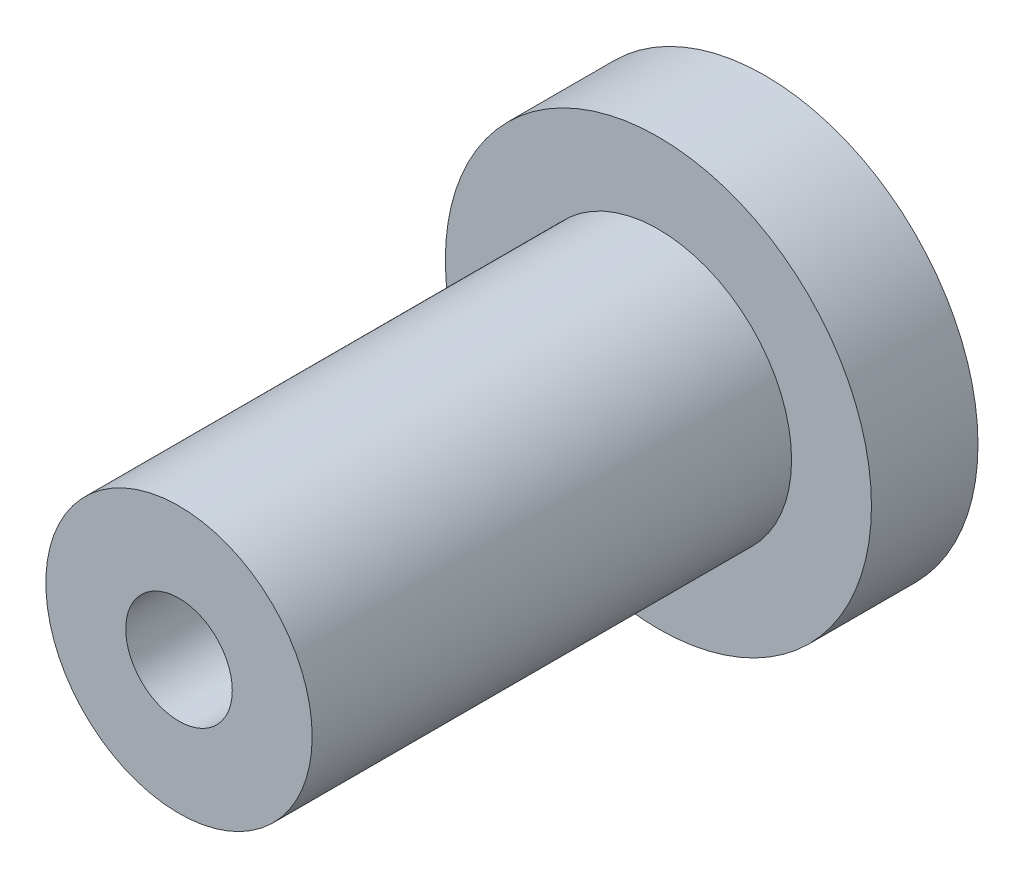
ISO-10303-21;
HEADER;
FILE_DESCRIPTION(('STEP AP214'),'2;1');
FILE_NAME('part.step','',(''),(''),'','','');
FILE_SCHEMA(('AUTOMOTIVE_DESIGN { 1 0 10303 214 1 1 1 1 }'));
ENDSEC;
DATA;
#1=APPLICATION_CONTEXT('core data for automotive mechanical design processes');
#2=APPLICATION_PROTOCOL_DEFINITION('international standard','automotive_design',2000,#1);
#3=PRODUCT_CONTEXT('',#1,'mechanical');
#4=PRODUCT('Part','Part','',(#3));
#5=PRODUCT_RELATED_PRODUCT_CATEGORY('part','',(#4));
#6=PRODUCT_DEFINITION_FORMATION('','',#4);
#7=PRODUCT_DEFINITION_CONTEXT('part definition',#1,'design');
#8=PRODUCT_DEFINITION('design','',#6,#7);
#9=PRODUCT_DEFINITION_SHAPE('','',#8);
#10=(LENGTH_UNIT() NAMED_UNIT(*) SI_UNIT(.MILLI.,.METRE.));
#11=(NAMED_UNIT(*) PLANE_ANGLE_UNIT() SI_UNIT($,.RADIAN.));
#12=(NAMED_UNIT(*) SI_UNIT($,.STERADIAN.) SOLID_ANGLE_UNIT());
#13=UNCERTAINTY_MEASURE_WITH_UNIT(LENGTH_MEASURE(1.E-05),#10,'distance_accuracy_value','');
#14=(GEOMETRIC_REPRESENTATION_CONTEXT(3) GLOBAL_UNCERTAINTY_ASSIGNED_CONTEXT((#13)) GLOBAL_UNIT_ASSIGNED_CONTEXT((#10,
#11,#12)) REPRESENTATION_CONTEXT('',''));
#15=CARTESIAN_POINT('',(0.,0.,0.));
#16=DIRECTION('',(0.,0.,1.));
#17=DIRECTION('',(1.,0.,0.));
#18=AXIS2_PLACEMENT_3D('',#15,#16,#17);
#19=CARTESIAN_POINT('',(0.,0.,2.));
#20=DIRECTION('',(0.,0.,-1.));
#21=DIRECTION('',(-1.,0.,0.));
#22=AXIS2_PLACEMENT_3D('',#19,#20,#21);
#23=CYLINDRICAL_SURFACE('',#22,4.);
#24=CARTESIAN_POINT('',(0.,0.,2.));
#25=DIRECTION('',(0.,0.,1.));
#26=DIRECTION('',(1.,0.,0.));
#27=AXIS2_PLACEMENT_3D('',#24,#25,#26);
#28=CIRCLE('',#27,4.);
#29=CARTESIAN_POINT('',(4.,0.,2.));
#30=VERTEX_POINT('',#29);
#31=EDGE_CURVE('E10',#30,#30,#28,.T.);
#32=ORIENTED_EDGE('',*,*,#31,.F.);
#33=EDGE_LOOP('',(#32));
#34=FACE_BOUND('',#33,.T.);
#35=CARTESIAN_POINT('',(0.,0.,0.));
#36=DIRECTION('',(0.,0.,1.));
#37=DIRECTION('',(1.,0.,0.));
#38=AXIS2_PLACEMENT_3D('',#35,#36,#37);
#39=CIRCLE('',#38,4.);
#40=CARTESIAN_POINT('',(4.,0.,0.));
#41=VERTEX_POINT('',#40);
#42=EDGE_CURVE('E46',#41,#41,#39,.T.);
#43=ORIENTED_EDGE('',*,*,#42,.T.);
#44=EDGE_LOOP('',(#43));
#45=FACE_BOUND('',#44,.T.);
#46=ADVANCED_FACE('F35',(#34,#45),#23,.T.);
#47=CARTESIAN_POINT('',(0.,0.,2.));
#48=DIRECTION('',(0.,0.,-1.));
#49=DIRECTION('',(-1.,0.,0.));
#50=AXIS2_PLACEMENT_3D('',#47,#48,#49);
#51=CYLINDRICAL_SURFACE('',#50,1.);
#52=CARTESIAN_POINT('',(0.,0.,0.));
#53=DIRECTION('',(0.,0.,1.));
#54=DIRECTION('',(1.,0.,0.));
#55=AXIS2_PLACEMENT_3D('',#52,#53,#54);
#56=CIRCLE('',#55,1.);
#57=CARTESIAN_POINT('',(1.,0.,0.));
#58=VERTEX_POINT('',#57);
#59=EDGE_CURVE('E38',#58,#58,#56,.T.);
#60=ORIENTED_EDGE('',*,*,#59,.F.);
#61=EDGE_LOOP('',(#60));
#62=FACE_BOUND('',#61,.T.);
#63=CARTESIAN_POINT('',(0.,0.,11.));
#64=DIRECTION('',(0.,0.,1.));
#65=DIRECTION('',(1.,0.,0.));
#66=AXIS2_PLACEMENT_3D('',#63,#64,#65);
#67=CIRCLE('',#66,1.);
#68=CARTESIAN_POINT('',(1.,0.,11.));
#69=VERTEX_POINT('',#68);
#70=EDGE_CURVE('E58',#69,#69,#67,.T.);
#71=ORIENTED_EDGE('',*,*,#70,.T.);
#72=EDGE_LOOP('',(#71));
#73=FACE_BOUND('',#72,.T.);
#74=ADVANCED_FACE('F65',(#62,#73),#51,.F.);
#75=CARTESIAN_POINT('',(0.,0.,2.));
#76=DIRECTION('',(0.,0.,1.));
#77=DIRECTION('',(1.,0.,0.));
#78=AXIS2_PLACEMENT_3D('',#75,#76,#77);
#79=PLANE('',#78);
#80=CARTESIAN_POINT('',(0.,0.,2.));
#81=DIRECTION('',(0.,0.,1.));
#82=DIRECTION('',(1.,0.,0.));
#83=AXIS2_PLACEMENT_3D('',#80,#81,#82);
#84=CIRCLE('',#83,2.5);
#85=CARTESIAN_POINT('',(2.5,0.,2.));
#86=VERTEX_POINT('',#85);
#87=EDGE_CURVE('E48',#86,#86,#84,.F.);
#88=ORIENTED_EDGE('',*,*,#87,.T.);
#89=EDGE_LOOP('',(#88));
#90=FACE_BOUND('',#89,.T.);
#91=ORIENTED_EDGE('',*,*,#31,.T.);
#92=EDGE_LOOP('',(#91));
#93=FACE_BOUND('',#92,.T.);
#94=ADVANCED_FACE('F82',(#90,#93),#79,.T.);
#95=CARTESIAN_POINT('',(0.,0.,0.));
#96=DIRECTION('',(0.,0.,1.));
#97=DIRECTION('',(1.,0.,0.));
#98=AXIS2_PLACEMENT_3D('',#95,#96,#97);
#99=PLANE('',#98);
#100=ORIENTED_EDGE('',*,*,#42,.F.);
#101=EDGE_LOOP('',(#100));
#102=FACE_BOUND('',#101,.T.);
#103=ORIENTED_EDGE('',*,*,#59,.T.);
#104=EDGE_LOOP('',(#103));
#105=FACE_BOUND('',#104,.T.);
#106=ADVANCED_FACE('F74',(#102,#105),#99,.F.);
#107=CARTESIAN_POINT('',(0.,0.,11.));
#108=DIRECTION('',(0.,0.,-1.));
#109=DIRECTION('',(-1.,0.,0.));
#110=AXIS2_PLACEMENT_3D('',#107,#108,#109);
#111=CYLINDRICAL_SURFACE('',#110,2.5);
#112=ORIENTED_EDGE('',*,*,#87,.F.);
#113=EDGE_LOOP('',(#112));
#114=FACE_BOUND('',#113,.T.);
#115=CARTESIAN_POINT('',(0.,0.,11.));
#116=DIRECTION('',(0.,0.,1.));
#117=DIRECTION('',(1.,0.,0.));
#118=AXIS2_PLACEMENT_3D('',#115,#116,#117);
#119=CIRCLE('',#118,2.5);
#120=CARTESIAN_POINT('',(2.5,0.,11.));
#121=VERTEX_POINT('',#120);
#122=EDGE_CURVE('E54',#121,#121,#119,.T.);
#123=ORIENTED_EDGE('',*,*,#122,.F.);
#124=EDGE_LOOP('',(#123));
#125=FACE_BOUND('',#124,.T.);
#126=ADVANCED_FACE('F69',(#114,#125),#111,.T.);
#127=CARTESIAN_POINT('',(0.,0.,11.));
#128=DIRECTION('',(0.,0.,1.));
#129=DIRECTION('',(1.,0.,0.));
#130=AXIS2_PLACEMENT_3D('',#127,#128,#129);
#131=PLANE('',#130);
#132=ORIENTED_EDGE('',*,*,#70,.F.);
#133=EDGE_LOOP('',(#132));
#134=FACE_BOUND('',#133,.T.);
#135=ORIENTED_EDGE('',*,*,#122,.T.);
#136=EDGE_LOOP('',(#135));
#137=FACE_BOUND('',#136,.T.);
#138=ADVANCED_FACE('F67',(#134,#137),#131,.T.);
#139=CLOSED_SHELL('',(#46,#74,#94,#106,#126,#138));
#140=MANIFOLD_SOLID_BREP('B2',#139);
#141=ADVANCED_BREP_SHAPE_REPRESENTATION('',(#18,#140),#14);
#142=SHAPE_DEFINITION_REPRESENTATION(#9,#141);
ENDSEC;
END-ISO-10303-21;
